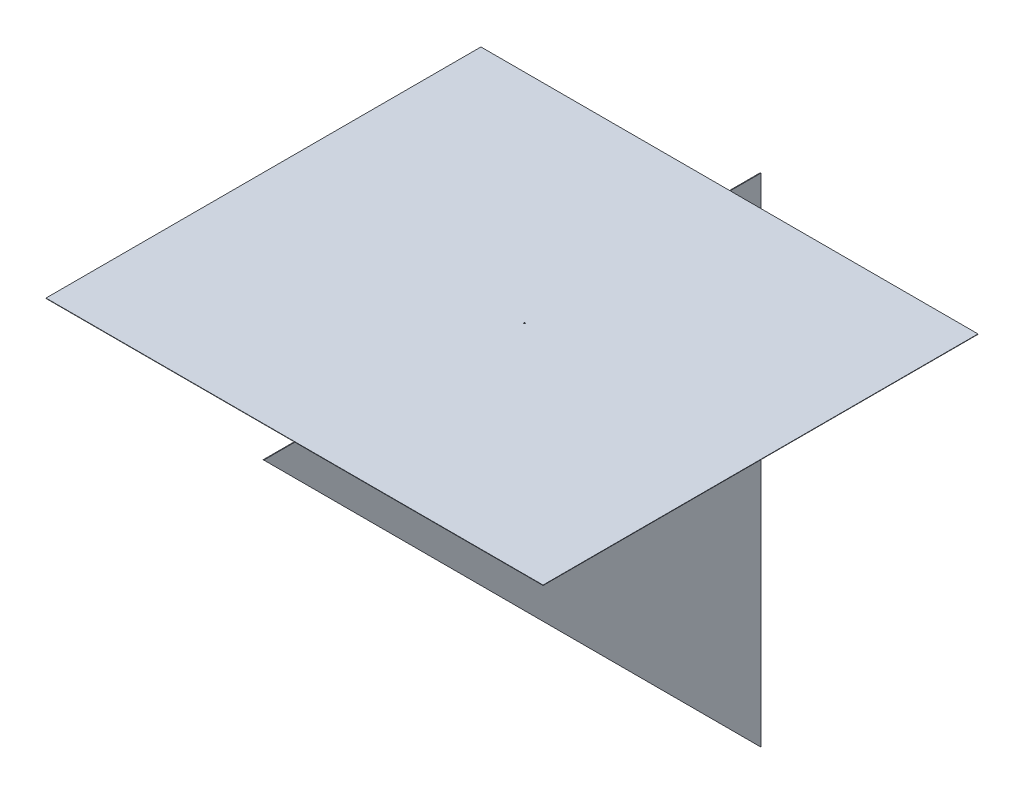
ISO-10303-21;
HEADER;
FILE_DESCRIPTION(('STEP AP214'),'2;1');
FILE_NAME('part.step','',(''),(''),'','','');
FILE_SCHEMA(('AUTOMOTIVE_DESIGN { 1 0 10303 214 1 1 1 1 }'));
ENDSEC;
DATA;
#1=APPLICATION_CONTEXT('core data for automotive mechanical design processes');
#2=APPLICATION_PROTOCOL_DEFINITION('international standard','automotive_design',2000,#1);
#3=PRODUCT_CONTEXT('',#1,'mechanical');
#4=PRODUCT('Part','Part','',(#3));
#5=PRODUCT_RELATED_PRODUCT_CATEGORY('part','',(#4));
#6=PRODUCT_DEFINITION_FORMATION('','',#4);
#7=PRODUCT_DEFINITION_CONTEXT('part definition',#1,'design');
#8=PRODUCT_DEFINITION('design','',#6,#7);
#9=PRODUCT_DEFINITION_SHAPE('','',#8);
#10=(LENGTH_UNIT() NAMED_UNIT(*) SI_UNIT(.MILLI.,.METRE.));
#11=(NAMED_UNIT(*) PLANE_ANGLE_UNIT() SI_UNIT($,.RADIAN.));
#12=(NAMED_UNIT(*) SI_UNIT($,.STERADIAN.) SOLID_ANGLE_UNIT());
#13=UNCERTAINTY_MEASURE_WITH_UNIT(LENGTH_MEASURE(1.E-05),#10,'distance_accuracy_value','');
#14=(GEOMETRIC_REPRESENTATION_CONTEXT(3) GLOBAL_UNCERTAINTY_ASSIGNED_CONTEXT((#13)) GLOBAL_UNIT_ASSIGNED_CONTEXT((#10,
#11,#12)) REPRESENTATION_CONTEXT('',''));
#15=CARTESIAN_POINT('',(0.,0.,0.));
#16=DIRECTION('',(0.,0.,1.));
#17=DIRECTION('',(1.,0.,0.));
#18=AXIS2_PLACEMENT_3D('',#15,#16,#17);
#19=CARTESIAN_POINT('',(5.,4000.,0.));
#20=DIRECTION('',(0.,-1.,0.));
#21=DIRECTION('',(0.,0.,-1.));
#22=AXIS2_PLACEMENT_3D('',#19,#20,#21);
#23=PLANE('',#22);
#24=DIRECTION('',(1.,0.,0.));
#25=VECTOR('',#24,1.);
#26=CARTESIAN_POINT('',(-1997.5,4000.,3750.));
#27=LINE('',#26,#25);
#28=CARTESIAN_POINT('',(0.,4000.,3750.));
#29=VERTEX_POINT('',#28);
#30=CARTESIAN_POINT('',(5.,4000.,3750.));
#31=VERTEX_POINT('',#30);
#32=EDGE_CURVE('E11',#29,#31,#27,.T.);
#33=ORIENTED_EDGE('',*,*,#32,.F.);
#34=DIRECTION('',(0.,0.,1.));
#35=VECTOR('',#34,1.);
#36=CARTESIAN_POINT('',(0.,4000.,0.));
#37=LINE('',#36,#35);
#38=CARTESIAN_POINT('',(0.,4000.,4000.));
#39=VERTEX_POINT('',#38);
#40=EDGE_CURVE('E147',#29,#39,#37,.T.);
#41=ORIENTED_EDGE('',*,*,#40,.T.);
#42=DIRECTION('',(-1.,0.,0.));
#43=VECTOR('',#42,1.);
#44=CARTESIAN_POINT('',(5.,4000.,4000.));
#45=LINE('',#44,#43);
#46=CARTESIAN_POINT('',(5.,4000.,4000.));
#47=VERTEX_POINT('',#46);
#48=EDGE_CURVE('E175',#47,#39,#45,.T.);
#49=ORIENTED_EDGE('',*,*,#48,.F.);
#50=DIRECTION('',(0.,0.,1.));
#51=VECTOR('',#50,1.);
#52=CARTESIAN_POINT('',(5.,4000.,0.));
#53=LINE('',#52,#51);
#54=EDGE_CURVE('E57',#31,#47,#53,.T.);
#55=ORIENTED_EDGE('',*,*,#54,.F.);
#56=EDGE_LOOP('',(#33,#41,#49,#55));
#57=FACE_BOUND('',#56,.T.);
#58=ADVANCED_FACE('F37',(#57),#23,.F.);
#59=DIRECTION('',(-1.,0.,0.));
#60=VECTOR('',#59,1.);
#61=CARTESIAN_POINT('',(-1997.5,4000.,250.));
#62=LINE('',#61,#60);
#63=CARTESIAN_POINT('',(5.,4000.,250.));
#64=VERTEX_POINT('',#63);
#65=CARTESIAN_POINT('',(0.,4000.,250.));
#66=VERTEX_POINT('',#65);
#67=EDGE_CURVE('E47',#64,#66,#62,.T.);
#68=ORIENTED_EDGE('',*,*,#67,.F.);
#69=CARTESIAN_POINT('',(5.,4000.,0.));
#70=VERTEX_POINT('',#69);
#71=EDGE_CURVE('E159',#70,#64,#53,.T.);
#72=ORIENTED_EDGE('',*,*,#71,.F.);
#73=DIRECTION('',(-1.,0.,0.));
#74=VECTOR('',#73,1.);
#75=CARTESIAN_POINT('',(5.,4000.,0.));
#76=LINE('',#75,#74);
#77=CARTESIAN_POINT('',(0.,4000.,0.));
#78=VERTEX_POINT('',#77);
#79=EDGE_CURVE('E41',#70,#78,#76,.T.);
#80=ORIENTED_EDGE('',*,*,#79,.T.);
#81=EDGE_CURVE('E167',#78,#66,#37,.T.);
#82=ORIENTED_EDGE('',*,*,#81,.T.);
#83=EDGE_LOOP('',(#68,#72,#80,#82));
#84=FACE_BOUND('',#83,.T.);
#85=ADVANCED_FACE('F236',(#84),#23,.F.);
#86=CARTESIAN_POINT('',(5.,0.,0.));
#87=DIRECTION('',(0.,0.,1.));
#88=DIRECTION('',(1.,0.,0.));
#89=AXIS2_PLACEMENT_3D('',#86,#87,#88);
#90=PLANE('',#89);
#91=DIRECTION('',(0.,1.,0.));
#92=VECTOR('',#91,1.);
#93=CARTESIAN_POINT('',(0.,0.,0.));
#94=LINE('',#93,#92);
#95=CARTESIAN_POINT('',(0.,0.,0.));
#96=VERTEX_POINT('',#95);
#97=EDGE_CURVE('E141',#96,#78,#94,.T.);
#98=ORIENTED_EDGE('',*,*,#97,.T.);
#99=ORIENTED_EDGE('',*,*,#79,.F.);
#100=DIRECTION('',(0.,1.,0.));
#101=VECTOR('',#100,1.);
#102=CARTESIAN_POINT('',(5.,0.,0.));
#103=LINE('',#102,#101);
#104=CARTESIAN_POINT('',(5.,0.,0.));
#105=VERTEX_POINT('',#104);
#106=EDGE_CURVE('E154',#105,#70,#103,.T.);
#107=ORIENTED_EDGE('',*,*,#106,.F.);
#108=DIRECTION('',(-1.,0.,0.));
#109=VECTOR('',#108,1.);
#110=CARTESIAN_POINT('',(5.,0.,0.));
#111=LINE('',#110,#109);
#112=EDGE_CURVE('E165',#105,#96,#111,.T.);
#113=ORIENTED_EDGE('',*,*,#112,.T.);
#114=EDGE_LOOP('',(#98,#99,#107,#113));
#115=FACE_BOUND('',#114,.T.);
#116=ADVANCED_FACE('F39',(#115),#90,.F.);
#117=CARTESIAN_POINT('',(5.,4000.,4000.));
#118=DIRECTION('',(0.,0.707106781186548,-0.707106781186547));
#119=DIRECTION('',(0.,0.707106781186547,0.707106781186548));
#120=AXIS2_PLACEMENT_3D('',#117,#118,#119);
#121=PLANE('',#120);
#122=DIRECTION('',(0.,-0.707106781186547,-0.707106781186548));
#123=VECTOR('',#122,1.);
#124=CARTESIAN_POINT('',(0.,4000.,4000.));
#125=LINE('',#124,#123);
#126=EDGE_CURVE('E158',#39,#96,#125,.T.);
#127=ORIENTED_EDGE('',*,*,#126,.T.);
#128=ORIENTED_EDGE('',*,*,#112,.F.);
#129=DIRECTION('',(0.,-0.707106781186547,-0.707106781186548));
#130=VECTOR('',#129,1.);
#131=CARTESIAN_POINT('',(5.,4000.,4000.));
#132=LINE('',#131,#130);
#133=EDGE_CURVE('E162',#47,#105,#132,.T.);
#134=ORIENTED_EDGE('',*,*,#133,.F.);
#135=ORIENTED_EDGE('',*,*,#48,.T.);
#136=EDGE_LOOP('',(#127,#128,#134,#135));
#137=FACE_BOUND('',#136,.T.);
#138=ADVANCED_FACE('F241',(#137),#121,.F.);
#139=CARTESIAN_POINT('',(5.,0.,0.));
#140=DIRECTION('',(1.,0.,0.));
#141=DIRECTION('',(0.,0.,-1.));
#142=AXIS2_PLACEMENT_3D('',#139,#140,#141);
#143=PLANE('',#142);
#144=ORIENTED_EDGE('',*,*,#106,.T.);
#145=ORIENTED_EDGE('',*,*,#71,.T.);
#146=EDGE_CURVE('E163',#64,#31,#53,.T.);
#147=ORIENTED_EDGE('',*,*,#146,.T.);
#148=ORIENTED_EDGE('',*,*,#54,.T.);
#149=ORIENTED_EDGE('',*,*,#133,.T.);
#150=EDGE_LOOP('',(#144,#145,#147,#148,#149));
#151=FACE_BOUND('',#150,.T.);
#152=ADVANCED_FACE('F244',(#151),#143,.T.);
#153=CARTESIAN_POINT('',(0.,0.,0.));
#154=DIRECTION('',(1.,0.,0.));
#155=DIRECTION('',(0.,0.,-1.));
#156=AXIS2_PLACEMENT_3D('',#153,#154,#155);
#157=PLANE('',#156);
#158=ORIENTED_EDGE('',*,*,#97,.F.);
#159=ORIENTED_EDGE('',*,*,#126,.F.);
#160=ORIENTED_EDGE('',*,*,#40,.F.);
#161=EDGE_CURVE('E170',#66,#29,#37,.T.);
#162=ORIENTED_EDGE('',*,*,#161,.F.);
#163=ORIENTED_EDGE('',*,*,#81,.F.);
#164=EDGE_LOOP('',(#158,#159,#160,#162,#163));
#165=FACE_BOUND('',#164,.T.);
#166=ADVANCED_FACE('F232',(#165),#157,.F.);
#167=CARTESIAN_POINT('',(0.,4000.,0.));
#168=DIRECTION('',(0.,-1.,0.));
#169=DIRECTION('',(0.,0.,-1.));
#170=AXIS2_PLACEMENT_3D('',#167,#168,#169);
#171=PLANE('',#170);
#172=CARTESIAN_POINT('',(102.5,4000.,2000.));
#173=DIRECTION('',(0.,1.,0.));
#174=DIRECTION('',(0.,0.,1.));
#175=AXIS2_PLACEMENT_3D('',#172,#173,#174);
#176=CIRCLE('',#175,5.00000000000001);
#177=CARTESIAN_POINT('',(102.5,4000.,2005.));
#178=VERTEX_POINT('',#177);
#179=EDGE_CURVE('E209',#178,#178,#176,.T.);
#180=ORIENTED_EDGE('',*,*,#179,.T.);
#181=EDGE_LOOP('',(#180));
#182=FACE_BOUND('',#181,.T.);
#183=ORIENTED_EDGE('',*,*,#146,.F.);
#184=CARTESIAN_POINT('',(2002.5,4000.,250.));
#185=VERTEX_POINT('',#184);
#186=EDGE_CURVE('E186',#185,#64,#62,.T.);
#187=ORIENTED_EDGE('',*,*,#186,.F.);
#188=DIRECTION('',(0.,0.,-1.));
#189=VECTOR('',#188,1.);
#190=CARTESIAN_POINT('',(2002.5,4000.,3750.));
#191=LINE('',#190,#189);
#192=CARTESIAN_POINT('',(2002.5,4000.,3750.));
#193=VERTEX_POINT('',#192);
#194=EDGE_CURVE('E139',#193,#185,#191,.T.);
#195=ORIENTED_EDGE('',*,*,#194,.F.);
#196=EDGE_CURVE('E50',#31,#193,#27,.T.);
#197=ORIENTED_EDGE('',*,*,#196,.F.);
#198=EDGE_LOOP('',(#183,#187,#195,#197));
#199=FACE_BOUND('',#198,.T.);
#200=ADVANCED_FACE('F224',(#182,#199),#171,.T.);
#201=CARTESIAN_POINT('',(0.,4003.,0.));
#202=DIRECTION('',(0.,-1.,0.));
#203=DIRECTION('',(0.,0.,-1.));
#204=AXIS2_PLACEMENT_3D('',#201,#202,#203);
#205=PLANE('',#204);
#206=DIRECTION('',(0.,0.,-1.));
#207=VECTOR('',#206,1.);
#208=CARTESIAN_POINT('',(2002.5,4003.,3750.));
#209=LINE('',#208,#207);
#210=CARTESIAN_POINT('',(2002.5,4003.,3750.));
#211=VERTEX_POINT('',#210);
#212=CARTESIAN_POINT('',(2002.5,4003.,250.));
#213=VERTEX_POINT('',#212);
#214=EDGE_CURVE('E125',#211,#213,#209,.T.);
#215=ORIENTED_EDGE('',*,*,#214,.T.);
#216=DIRECTION('',(-1.,0.,0.));
#217=VECTOR('',#216,1.);
#218=CARTESIAN_POINT('',(-1997.5,4003.,250.));
#219=LINE('',#218,#217);
#220=CARTESIAN_POINT('',(-1997.5,4003.,250.));
#221=VERTEX_POINT('',#220);
#222=EDGE_CURVE('E112',#213,#221,#219,.T.);
#223=ORIENTED_EDGE('',*,*,#222,.T.);
#224=DIRECTION('',(0.,0.,1.));
#225=VECTOR('',#224,1.);
#226=CARTESIAN_POINT('',(-1997.5,4003.,3750.));
#227=LINE('',#226,#225);
#228=CARTESIAN_POINT('',(-1997.5,4003.,3750.));
#229=VERTEX_POINT('',#228);
#230=EDGE_CURVE('E124',#221,#229,#227,.T.);
#231=ORIENTED_EDGE('',*,*,#230,.T.);
#232=DIRECTION('',(1.,0.,0.));
#233=VECTOR('',#232,1.);
#234=CARTESIAN_POINT('',(-1997.5,4003.,3750.));
#235=LINE('',#234,#233);
#236=EDGE_CURVE('E131',#229,#211,#235,.T.);
#237=ORIENTED_EDGE('',*,*,#236,.T.);
#238=EDGE_LOOP('',(#215,#223,#231,#237));
#239=FACE_BOUND('',#238,.T.);
#240=CARTESIAN_POINT('',(-97.5000000000003,4003.,2000.));
#241=DIRECTION('',(0.,1.,0.));
#242=DIRECTION('',(0.,0.,1.));
#243=AXIS2_PLACEMENT_3D('',#240,#241,#242);
#244=CIRCLE('',#243,0.49999999999994);
#245=CARTESIAN_POINT('',(-97.5000000000003,4003.,2000.5));
#246=VERTEX_POINT('',#245);
#247=EDGE_CURVE('E194',#246,#246,#244,.T.);
#248=ORIENTED_EDGE('',*,*,#247,.F.);
#249=EDGE_LOOP('',(#248));
#250=FACE_BOUND('',#249,.T.);
#251=CARTESIAN_POINT('',(102.5,4003.,2000.));
#252=DIRECTION('',(0.,1.,0.));
#253=DIRECTION('',(0.,0.,1.));
#254=AXIS2_PLACEMENT_3D('',#251,#252,#253);
#255=CIRCLE('',#254,5.00000000000001);
#256=CARTESIAN_POINT('',(102.5,4003.,2005.));
#257=VERTEX_POINT('',#256);
#258=EDGE_CURVE('E207',#257,#257,#255,.T.);
#259=ORIENTED_EDGE('',*,*,#258,.F.);
#260=EDGE_LOOP('',(#259));
#261=FACE_BOUND('',#260,.T.);
#262=ADVANCED_FACE('F128',(#239,#250,#261),#205,.F.);
#263=CARTESIAN_POINT('',(-97.5000000000003,4000.,2000.));
#264=DIRECTION('',(0.,1.,0.));
#265=DIRECTION('',(0.,0.,1.));
#266=AXIS2_PLACEMENT_3D('',#263,#264,#265);
#267=CIRCLE('',#266,0.49999999999994);
#268=CARTESIAN_POINT('',(-97.5000000000003,4000.,2000.5));
#269=VERTEX_POINT('',#268);
#270=EDGE_CURVE('E198',#269,#269,#267,.T.);
#271=ORIENTED_EDGE('',*,*,#270,.T.);
#272=EDGE_LOOP('',(#271));
#273=FACE_BOUND('',#272,.T.);
#274=CARTESIAN_POINT('',(-1997.5,4000.,250.));
#275=VERTEX_POINT('',#274);
#276=EDGE_CURVE('E187',#66,#275,#62,.T.);
#277=ORIENTED_EDGE('',*,*,#276,.F.);
#278=ORIENTED_EDGE('',*,*,#161,.T.);
#279=CARTESIAN_POINT('',(-1997.5,4000.,3750.));
#280=VERTEX_POINT('',#279);
#281=EDGE_CURVE('E49',#280,#29,#27,.T.);
#282=ORIENTED_EDGE('',*,*,#281,.F.);
#283=DIRECTION('',(0.,0.,1.));
#284=VECTOR('',#283,1.);
#285=CARTESIAN_POINT('',(-1997.5,4000.,3750.));
#286=LINE('',#285,#284);
#287=EDGE_CURVE('E191',#275,#280,#286,.T.);
#288=ORIENTED_EDGE('',*,*,#287,.F.);
#289=EDGE_LOOP('',(#277,#278,#282,#288));
#290=FACE_BOUND('',#289,.T.);
#291=ADVANCED_FACE('F223',(#273,#290),#171,.T.);
#292=CARTESIAN_POINT('',(2002.5,4003.,3750.));
#293=DIRECTION('',(-1.,0.,0.));
#294=DIRECTION('',(0.,0.,1.));
#295=AXIS2_PLACEMENT_3D('',#292,#293,#294);
#296=PLANE('',#295);
#297=ORIENTED_EDGE('',*,*,#194,.T.);
#298=DIRECTION('',(0.,-1.,0.));
#299=VECTOR('',#298,1.);
#300=CARTESIAN_POINT('',(2002.5,4003.,250.));
#301=LINE('',#300,#299);
#302=EDGE_CURVE('E117',#213,#185,#301,.T.);
#303=ORIENTED_EDGE('',*,*,#302,.F.);
#304=ORIENTED_EDGE('',*,*,#214,.F.);
#305=DIRECTION('',(0.,-1.,0.));
#306=VECTOR('',#305,1.);
#307=CARTESIAN_POINT('',(2002.5,4003.,3750.));
#308=LINE('',#307,#306);
#309=EDGE_CURVE('E203',#211,#193,#308,.T.);
#310=ORIENTED_EDGE('',*,*,#309,.T.);
#311=EDGE_LOOP('',(#297,#303,#304,#310));
#312=FACE_BOUND('',#311,.T.);
#313=ADVANCED_FACE('F137',(#312),#296,.F.);
#314=CARTESIAN_POINT('',(-1997.5,4003.,250.));
#315=DIRECTION('',(0.,0.,1.));
#316=DIRECTION('',(1.,0.,0.));
#317=AXIS2_PLACEMENT_3D('',#314,#315,#316);
#318=PLANE('',#317);
#319=ORIENTED_EDGE('',*,*,#186,.T.);
#320=ORIENTED_EDGE('',*,*,#67,.T.);
#321=ORIENTED_EDGE('',*,*,#276,.T.);
#322=DIRECTION('',(0.,-1.,0.));
#323=VECTOR('',#322,1.);
#324=CARTESIAN_POINT('',(-1997.5,4003.,250.));
#325=LINE('',#324,#323);
#326=EDGE_CURVE('E120',#221,#275,#325,.T.);
#327=ORIENTED_EDGE('',*,*,#326,.F.);
#328=ORIENTED_EDGE('',*,*,#222,.F.);
#329=ORIENTED_EDGE('',*,*,#302,.T.);
#330=EDGE_LOOP('',(#319,#320,#321,#327,#328,#329));
#331=FACE_BOUND('',#330,.T.);
#332=ADVANCED_FACE('F115',(#331),#318,.F.);
#333=CARTESIAN_POINT('',(-1997.5,4003.,3750.));
#334=DIRECTION('',(1.,0.,0.));
#335=DIRECTION('',(0.,0.,-1.));
#336=AXIS2_PLACEMENT_3D('',#333,#334,#335);
#337=PLANE('',#336);
#338=ORIENTED_EDGE('',*,*,#287,.T.);
#339=DIRECTION('',(0.,-1.,0.));
#340=VECTOR('',#339,1.);
#341=CARTESIAN_POINT('',(-1997.5,4003.,3750.));
#342=LINE('',#341,#340);
#343=EDGE_CURVE('E150',#229,#280,#342,.T.);
#344=ORIENTED_EDGE('',*,*,#343,.F.);
#345=ORIENTED_EDGE('',*,*,#230,.F.);
#346=ORIENTED_EDGE('',*,*,#326,.T.);
#347=EDGE_LOOP('',(#338,#344,#345,#346));
#348=FACE_BOUND('',#347,.T.);
#349=ADVANCED_FACE('F255',(#348),#337,.F.);
#350=CARTESIAN_POINT('',(-1997.5,4003.,3750.));
#351=DIRECTION('',(0.,0.,-1.));
#352=DIRECTION('',(-1.,0.,0.));
#353=AXIS2_PLACEMENT_3D('',#350,#351,#352);
#354=PLANE('',#353);
#355=ORIENTED_EDGE('',*,*,#281,.T.);
#356=ORIENTED_EDGE('',*,*,#32,.T.);
#357=ORIENTED_EDGE('',*,*,#196,.T.);
#358=ORIENTED_EDGE('',*,*,#309,.F.);
#359=ORIENTED_EDGE('',*,*,#236,.F.);
#360=ORIENTED_EDGE('',*,*,#343,.T.);
#361=EDGE_LOOP('',(#355,#356,#357,#358,#359,#360));
#362=FACE_BOUND('',#361,.T.);
#363=ADVANCED_FACE('F258',(#362),#354,.F.);
#364=CARTESIAN_POINT('',(-97.5000000000003,4003.,2000.));
#365=DIRECTION('',(0.,-1.,0.));
#366=DIRECTION('',(0.,0.,-1.));
#367=AXIS2_PLACEMENT_3D('',#364,#365,#366);
#368=CYLINDRICAL_SURFACE('',#367,0.49999999999994);
#369=ORIENTED_EDGE('',*,*,#247,.T.);
#370=EDGE_LOOP('',(#369));
#371=FACE_BOUND('',#370,.T.);
#372=ORIENTED_EDGE('',*,*,#270,.F.);
#373=EDGE_LOOP('',(#372));
#374=FACE_BOUND('',#373,.T.);
#375=ADVANCED_FACE('F261',(#371,#374),#368,.F.);
#376=CARTESIAN_POINT('',(102.5,4003.,2000.));
#377=DIRECTION('',(0.,-1.,0.));
#378=DIRECTION('',(0.,0.,-1.));
#379=AXIS2_PLACEMENT_3D('',#376,#377,#378);
#380=CYLINDRICAL_SURFACE('',#379,5.00000000000001);
#381=ORIENTED_EDGE('',*,*,#258,.T.);
#382=EDGE_LOOP('',(#381));
#383=FACE_BOUND('',#382,.T.);
#384=ORIENTED_EDGE('',*,*,#179,.F.);
#385=EDGE_LOOP('',(#384));
#386=FACE_BOUND('',#385,.T.);
#387=ADVANCED_FACE('F219',(#383,#386),#380,.F.);
#388=CLOSED_SHELL('',(#58,#85,#116,#138,#152,#166,#200,#262,#291,#313,#332,#349,#363,#375,#387));
#389=MANIFOLD_SOLID_BREP('B2',#388);
#390=ADVANCED_BREP_SHAPE_REPRESENTATION('',(#18,#389),#14);
#391=SHAPE_DEFINITION_REPRESENTATION(#9,#390);
ENDSEC;
END-ISO-10303-21;
